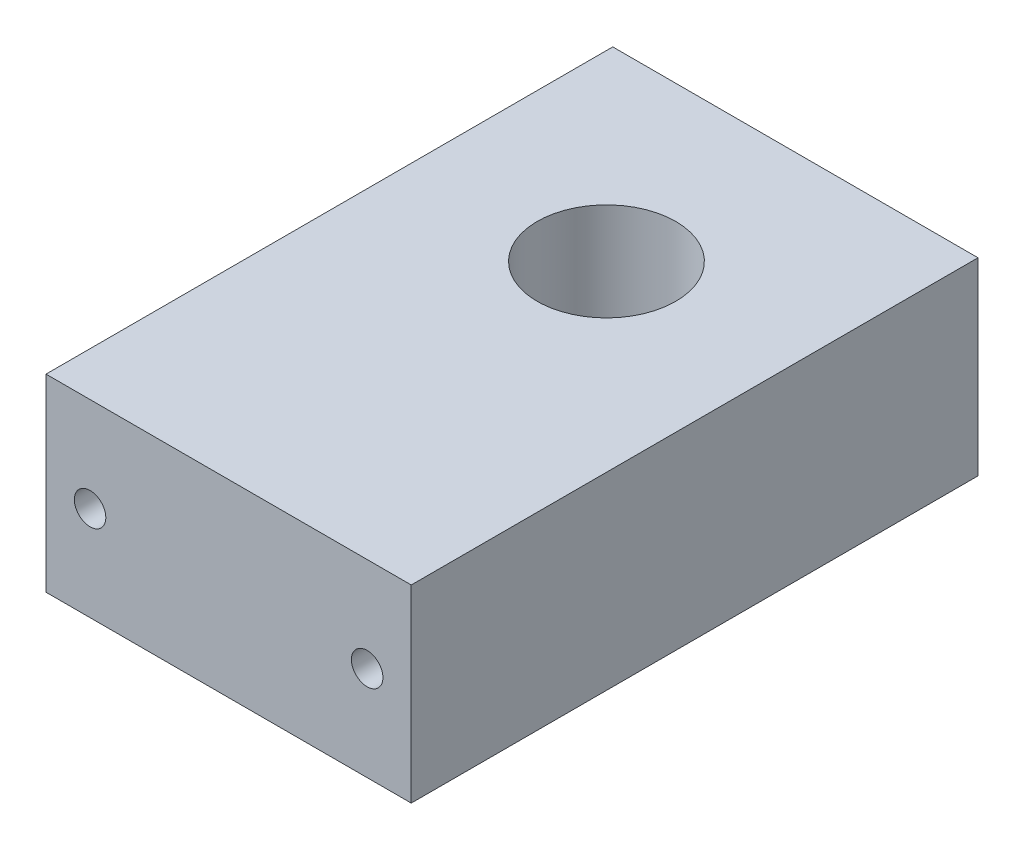
ISO-10303-21;
HEADER;
FILE_DESCRIPTION(('STEP AP214'),'2;1');
FILE_NAME('part.step','',(''),(''),'','','');
FILE_SCHEMA(('AUTOMOTIVE_DESIGN { 1 0 10303 214 1 1 1 1 }'));
ENDSEC;
DATA;
#1=APPLICATION_CONTEXT('core data for automotive mechanical design processes');
#2=APPLICATION_PROTOCOL_DEFINITION('international standard','automotive_design',2000,#1);
#3=PRODUCT_CONTEXT('',#1,'mechanical');
#4=PRODUCT('Part','Part','',(#3));
#5=PRODUCT_RELATED_PRODUCT_CATEGORY('part','',(#4));
#6=PRODUCT_DEFINITION_FORMATION('','',#4);
#7=PRODUCT_DEFINITION_CONTEXT('part definition',#1,'design');
#8=PRODUCT_DEFINITION('design','',#6,#7);
#9=PRODUCT_DEFINITION_SHAPE('','',#8);
#10=(LENGTH_UNIT() NAMED_UNIT(*) SI_UNIT(.MILLI.,.METRE.));
#11=(NAMED_UNIT(*) PLANE_ANGLE_UNIT() SI_UNIT($,.RADIAN.));
#12=(NAMED_UNIT(*) SI_UNIT($,.STERADIAN.) SOLID_ANGLE_UNIT());
#13=UNCERTAINTY_MEASURE_WITH_UNIT(LENGTH_MEASURE(1.E-05),#10,'distance_accuracy_value','');
#14=(GEOMETRIC_REPRESENTATION_CONTEXT(3) GLOBAL_UNCERTAINTY_ASSIGNED_CONTEXT((#13)) GLOBAL_UNIT_ASSIGNED_CONTEXT((#10,
#11,#12)) REPRESENTATION_CONTEXT('',''));
#15=CARTESIAN_POINT('',(0.,0.,0.));
#16=DIRECTION('',(0.,0.,1.));
#17=DIRECTION('',(1.,0.,0.));
#18=AXIS2_PLACEMENT_3D('',#15,#16,#17);
#19=CARTESIAN_POINT('',(-43.1265602569151,704.486311853786,140.600281854237));
#20=DIRECTION('',(1.,0.,0.));
#21=DIRECTION('',(0.,1.,0.));
#22=AXIS2_PLACEMENT_3D('',#19,#20,#21);
#23=PLANE('',#22);
#24=DIRECTION('',(0.,-1.,0.));
#25=VECTOR('',#24,1.);
#26=CARTESIAN_POINT('',(-43.1265602569151,704.486311853786,75.3009709849791));
#27=LINE('',#26,#25);
#28=CARTESIAN_POINT('',(-43.1265602569151,704.486311853786,75.3009709849791));
#29=VERTEX_POINT('',#28);
#30=CARTESIAN_POINT('',(-43.126560256915,674.486311853786,75.3009709849791));
#31=VERTEX_POINT('',#30);
#32=EDGE_CURVE('E83',#29,#31,#27,.T.);
#33=ORIENTED_EDGE('',*,*,#32,.F.);
#34=DIRECTION('',(0.,0.,-1.));
#35=VECTOR('',#34,1.);
#36=CARTESIAN_POINT('',(-43.1265602569151,704.486311853786,140.600281854237));
#37=LINE('',#36,#35);
#38=CARTESIAN_POINT('',(-43.1265602569151,704.486311853786,-14.6990290150209));
#39=VERTEX_POINT('',#38);
#40=EDGE_CURVE('E37',#29,#39,#37,.T.);
#41=ORIENTED_EDGE('',*,*,#40,.T.);
#42=DIRECTION('',(0.,-1.,0.));
#43=VECTOR('',#42,1.);
#44=CARTESIAN_POINT('',(-43.1265602569151,704.486311853786,-14.6990290150209));
#45=LINE('',#44,#43);
#46=CARTESIAN_POINT('',(-43.126560256915,674.486311853786,-14.6990290150209));
#47=VERTEX_POINT('',#46);
#48=EDGE_CURVE('E81',#39,#47,#45,.T.);
#49=ORIENTED_EDGE('',*,*,#48,.T.);
#50=DIRECTION('',(0.,0.,-1.));
#51=VECTOR('',#50,1.);
#52=CARTESIAN_POINT('',(-43.126560256915,674.486311853786,140.600281854237));
#53=LINE('',#52,#51);
#54=EDGE_CURVE('E72',#31,#47,#53,.T.);
#55=ORIENTED_EDGE('',*,*,#54,.F.);
#56=EDGE_LOOP('',(#33,#41,#49,#55));
#57=FACE_BOUND('',#56,.T.);
#58=ADVANCED_FACE('F33',(#57),#23,.F.);
#59=CARTESIAN_POINT('',(-14.126560256915,674.486311853786,140.600281854237));
#60=DIRECTION('',(0.,1.,0.));
#61=DIRECTION('',(0.,0.,1.));
#62=AXIS2_PLACEMENT_3D('',#59,#60,#61);
#63=PLANE('',#62);
#64=CARTESIAN_POINT('',(-14.126560256915,674.486311853786,15.3009709849791));
#65=DIRECTION('',(0.,-1.,0.));
#66=DIRECTION('',(0.,0.,-1.));
#67=AXIS2_PLACEMENT_3D('',#64,#65,#66);
#68=CIRCLE('',#67,11.);
#69=CARTESIAN_POINT('',(-14.126560256915,674.486311853786,4.30097098497909));
#70=VERTEX_POINT('',#69);
#71=EDGE_CURVE('E107',#70,#70,#68,.T.);
#72=ORIENTED_EDGE('',*,*,#71,.F.);
#73=EDGE_LOOP('',(#72));
#74=FACE_BOUND('',#73,.T.);
#75=DIRECTION('',(1.,0.,0.));
#76=VECTOR('',#75,1.);
#77=CARTESIAN_POINT('',(-14.126560256915,674.486311853786,75.3009709849791));
#78=LINE('',#77,#76);
#79=CARTESIAN_POINT('',(14.873439743085,674.486311853786,75.3009709849791));
#80=VERTEX_POINT('',#79);
#81=EDGE_CURVE('E42',#31,#80,#78,.T.);
#82=ORIENTED_EDGE('',*,*,#81,.F.);
#83=ORIENTED_EDGE('',*,*,#54,.T.);
#84=DIRECTION('',(1.,0.,0.));
#85=VECTOR('',#84,1.);
#86=CARTESIAN_POINT('',(-14.126560256915,674.486311853786,-14.6990290150209));
#87=LINE('',#86,#85);
#88=CARTESIAN_POINT('',(14.873439743085,674.486311853786,-14.6990290150209));
#89=VERTEX_POINT('',#88);
#90=EDGE_CURVE('E94',#47,#89,#87,.T.);
#91=ORIENTED_EDGE('',*,*,#90,.T.);
#92=DIRECTION('',(0.,0.,-1.));
#93=VECTOR('',#92,1.);
#94=CARTESIAN_POINT('',(14.873439743085,674.486311853786,140.600281854237));
#95=LINE('',#94,#93);
#96=EDGE_CURVE('E103',#80,#89,#95,.T.);
#97=ORIENTED_EDGE('',*,*,#96,.F.);
#98=EDGE_LOOP('',(#82,#83,#91,#97));
#99=FACE_BOUND('',#98,.T.);
#100=ADVANCED_FACE('F139',(#74,#99),#63,.F.);
#101=CARTESIAN_POINT('',(14.873439743085,674.486311853786,140.600281854237));
#102=DIRECTION('',(-1.,0.,0.));
#103=DIRECTION('',(0.,0.,1.));
#104=AXIS2_PLACEMENT_3D('',#101,#102,#103);
#105=PLANE('',#104);
#106=DIRECTION('',(0.,1.,0.));
#107=VECTOR('',#106,1.);
#108=CARTESIAN_POINT('',(14.873439743085,674.486311853786,75.3009709849791));
#109=LINE('',#108,#107);
#110=CARTESIAN_POINT('',(14.873439743085,704.486311853786,75.3009709849791));
#111=VERTEX_POINT('',#110);
#112=EDGE_CURVE('E11',#80,#111,#109,.T.);
#113=ORIENTED_EDGE('',*,*,#112,.F.);
#114=ORIENTED_EDGE('',*,*,#96,.T.);
#115=DIRECTION('',(0.,1.,0.));
#116=VECTOR('',#115,1.);
#117=CARTESIAN_POINT('',(14.873439743085,674.486311853786,-14.6990290150209));
#118=LINE('',#117,#116);
#119=CARTESIAN_POINT('',(14.873439743085,704.486311853786,-14.6990290150209));
#120=VERTEX_POINT('',#119);
#121=EDGE_CURVE('E104',#89,#120,#118,.T.);
#122=ORIENTED_EDGE('',*,*,#121,.T.);
#123=DIRECTION('',(0.,0.,-1.));
#124=VECTOR('',#123,1.);
#125=CARTESIAN_POINT('',(14.873439743085,704.486311853786,140.600281854237));
#126=LINE('',#125,#124);
#127=EDGE_CURVE('E55',#111,#120,#126,.T.);
#128=ORIENTED_EDGE('',*,*,#127,.F.);
#129=EDGE_LOOP('',(#113,#114,#122,#128));
#130=FACE_BOUND('',#129,.T.);
#131=ADVANCED_FACE('F143',(#130),#105,.F.);
#132=CARTESIAN_POINT('',(14.873439743085,704.486311853786,140.600281854237));
#133=DIRECTION('',(0.,-1.,0.));
#134=DIRECTION('',(0.,0.,-1.));
#135=AXIS2_PLACEMENT_3D('',#132,#133,#134);
#136=PLANE('',#135);
#137=CARTESIAN_POINT('',(-14.126560256915,704.486311853786,15.3009709849791));
#138=DIRECTION('',(0.,-1.,0.));
#139=DIRECTION('',(0.,0.,-1.));
#140=AXIS2_PLACEMENT_3D('',#137,#138,#139);
#141=CIRCLE('',#140,11.);
#142=CARTESIAN_POINT('',(-14.126560256915,704.486311853786,4.30097098497909));
#143=VERTEX_POINT('',#142);
#144=EDGE_CURVE('E85',#143,#143,#141,.T.);
#145=ORIENTED_EDGE('',*,*,#144,.T.);
#146=EDGE_LOOP('',(#145));
#147=FACE_BOUND('',#146,.T.);
#148=DIRECTION('',(-1.,0.,0.));
#149=VECTOR('',#148,1.);
#150=CARTESIAN_POINT('',(14.873439743085,704.486311853786,75.3009709849791));
#151=LINE('',#150,#149);
#152=EDGE_CURVE('E91',#111,#29,#151,.T.);
#153=ORIENTED_EDGE('',*,*,#152,.F.);
#154=ORIENTED_EDGE('',*,*,#127,.T.);
#155=DIRECTION('',(-1.,0.,0.));
#156=VECTOR('',#155,1.);
#157=CARTESIAN_POINT('',(14.873439743085,704.486311853786,-14.6990290150209));
#158=LINE('',#157,#156);
#159=EDGE_CURVE('E87',#120,#39,#158,.T.);
#160=ORIENTED_EDGE('',*,*,#159,.T.);
#161=ORIENTED_EDGE('',*,*,#40,.F.);
#162=EDGE_LOOP('',(#153,#154,#160,#161));
#163=FACE_BOUND('',#162,.T.);
#164=ADVANCED_FACE('F88',(#147,#163),#136,.F.);
#165=CARTESIAN_POINT('',(0.,0.,-14.6990290150209));
#166=DIRECTION('',(0.,0.,1.));
#167=DIRECTION('',(1.,0.,0.));
#168=AXIS2_PLACEMENT_3D('',#165,#166,#167);
#169=PLANE('',#168);
#170=CARTESIAN_POINT('',(7.87343974308485,689.486311853786,-14.6990290150209));
#171=DIRECTION('',(0.,0.,1.));
#172=DIRECTION('',(1.,0.,0.));
#173=AXIS2_PLACEMENT_3D('',#170,#171,#172);
#174=CIRCLE('',#173,2.49999999999997);
#175=CARTESIAN_POINT('',(10.3734397430848,689.486311853786,-14.6990290150209));
#176=VERTEX_POINT('',#175);
#177=EDGE_CURVE('E121',#176,#176,#174,.T.);
#178=ORIENTED_EDGE('',*,*,#177,.T.);
#179=EDGE_LOOP('',(#178));
#180=FACE_BOUND('',#179,.T.);
#181=CARTESIAN_POINT('',(-36.1265602569154,689.486311853786,-14.6990290150209));
#182=DIRECTION('',(0.,0.,1.));
#183=DIRECTION('',(1.,0.,0.));
#184=AXIS2_PLACEMENT_3D('',#181,#182,#183);
#185=CIRCLE('',#184,2.49999999999997);
#186=CARTESIAN_POINT('',(-33.6265602569154,689.486311853786,-14.6990290150209));
#187=VERTEX_POINT('',#186);
#188=EDGE_CURVE('E115',#187,#187,#185,.T.);
#189=ORIENTED_EDGE('',*,*,#188,.T.);
#190=EDGE_LOOP('',(#189));
#191=FACE_BOUND('',#190,.T.);
#192=ORIENTED_EDGE('',*,*,#48,.F.);
#193=ORIENTED_EDGE('',*,*,#159,.F.);
#194=ORIENTED_EDGE('',*,*,#121,.F.);
#195=ORIENTED_EDGE('',*,*,#90,.F.);
#196=EDGE_LOOP('',(#192,#193,#194,#195));
#197=FACE_BOUND('',#196,.T.);
#198=ADVANCED_FACE('F93',(#180,#191,#197),#169,.F.);
#199=CARTESIAN_POINT('',(-14.126560256915,126.071847680874,75.3009709849791));
#200=DIRECTION('',(0.,0.,1.));
#201=DIRECTION('',(0.,-1.,0.));
#202=AXIS2_PLACEMENT_3D('',#199,#200,#201);
#203=PLANE('',#202);
#204=CARTESIAN_POINT('',(7.87343974308485,689.486311853786,75.3009709849791));
#205=DIRECTION('',(0.,0.,1.));
#206=DIRECTION('',(1.,0.,0.));
#207=AXIS2_PLACEMENT_3D('',#204,#205,#206);
#208=CIRCLE('',#207,2.49999999999997);
#209=CARTESIAN_POINT('',(10.3734397430848,689.486311853786,75.3009709849791));
#210=VERTEX_POINT('',#209);
#211=EDGE_CURVE('E118',#210,#210,#208,.T.);
#212=ORIENTED_EDGE('',*,*,#211,.F.);
#213=EDGE_LOOP('',(#212));
#214=FACE_BOUND('',#213,.T.);
#215=CARTESIAN_POINT('',(-36.1265602569154,689.486311853786,75.3009709849791));
#216=DIRECTION('',(0.,0.,1.));
#217=DIRECTION('',(1.,0.,0.));
#218=AXIS2_PLACEMENT_3D('',#215,#216,#217);
#219=CIRCLE('',#218,2.49999999999997);
#220=CARTESIAN_POINT('',(-33.6265602569154,689.486311853786,75.3009709849791));
#221=VERTEX_POINT('',#220);
#222=EDGE_CURVE('E110',#221,#221,#219,.T.);
#223=ORIENTED_EDGE('',*,*,#222,.F.);
#224=EDGE_LOOP('',(#223));
#225=FACE_BOUND('',#224,.T.);
#226=ORIENTED_EDGE('',*,*,#152,.T.);
#227=ORIENTED_EDGE('',*,*,#32,.T.);
#228=ORIENTED_EDGE('',*,*,#81,.T.);
#229=ORIENTED_EDGE('',*,*,#112,.T.);
#230=EDGE_LOOP('',(#226,#227,#228,#229));
#231=FACE_BOUND('',#230,.T.);
#232=ADVANCED_FACE('F35',(#214,#225,#231),#203,.T.);
#233=CARTESIAN_POINT('',(-14.126560256915,704.486311853786,15.3009709849791));
#234=DIRECTION('',(0.,-1.,0.));
#235=DIRECTION('',(0.,0.,-1.));
#236=AXIS2_PLACEMENT_3D('',#233,#234,#235);
#237=CYLINDRICAL_SURFACE('',#236,11.);
#238=ORIENTED_EDGE('',*,*,#144,.F.);
#239=EDGE_LOOP('',(#238));
#240=FACE_BOUND('',#239,.T.);
#241=ORIENTED_EDGE('',*,*,#71,.T.);
#242=EDGE_LOOP('',(#241));
#243=FACE_BOUND('',#242,.T.);
#244=ADVANCED_FACE('F135',(#240,#243),#237,.F.);
#245=CARTESIAN_POINT('',(-36.1265602569154,689.486311853786,85.3009709849792));
#246=DIRECTION('',(0.,0.,1.));
#247=DIRECTION('',(1.,0.,0.));
#248=AXIS2_PLACEMENT_3D('',#245,#246,#247);
#249=CYLINDRICAL_SURFACE('',#248,2.49999999999997);
#250=ORIENTED_EDGE('',*,*,#222,.T.);
#251=EDGE_LOOP('',(#250));
#252=FACE_BOUND('',#251,.T.);
#253=ORIENTED_EDGE('',*,*,#188,.F.);
#254=EDGE_LOOP('',(#253));
#255=FACE_BOUND('',#254,.T.);
#256=ADVANCED_FACE('F129',(#252,#255),#249,.F.);
#257=CARTESIAN_POINT('',(7.87343974308485,689.486311853786,85.3009709849792));
#258=DIRECTION('',(0.,0.,1.));
#259=DIRECTION('',(1.,0.,0.));
#260=AXIS2_PLACEMENT_3D('',#257,#258,#259);
#261=CYLINDRICAL_SURFACE('',#260,2.49999999999997);
#262=ORIENTED_EDGE('',*,*,#211,.T.);
#263=EDGE_LOOP('',(#262));
#264=FACE_BOUND('',#263,.T.);
#265=ORIENTED_EDGE('',*,*,#177,.F.);
#266=EDGE_LOOP('',(#265));
#267=FACE_BOUND('',#266,.T.);
#268=ADVANCED_FACE('F127',(#264,#267),#261,.F.);
#269=CLOSED_SHELL('',(#58,#100,#131,#164,#198,#232,#244,#256,#268));
#270=MANIFOLD_SOLID_BREP('B2',#269);
#271=ADVANCED_BREP_SHAPE_REPRESENTATION('',(#18,#270),#14);
#272=SHAPE_DEFINITION_REPRESENTATION(#9,#271);
ENDSEC;
END-ISO-10303-21;
